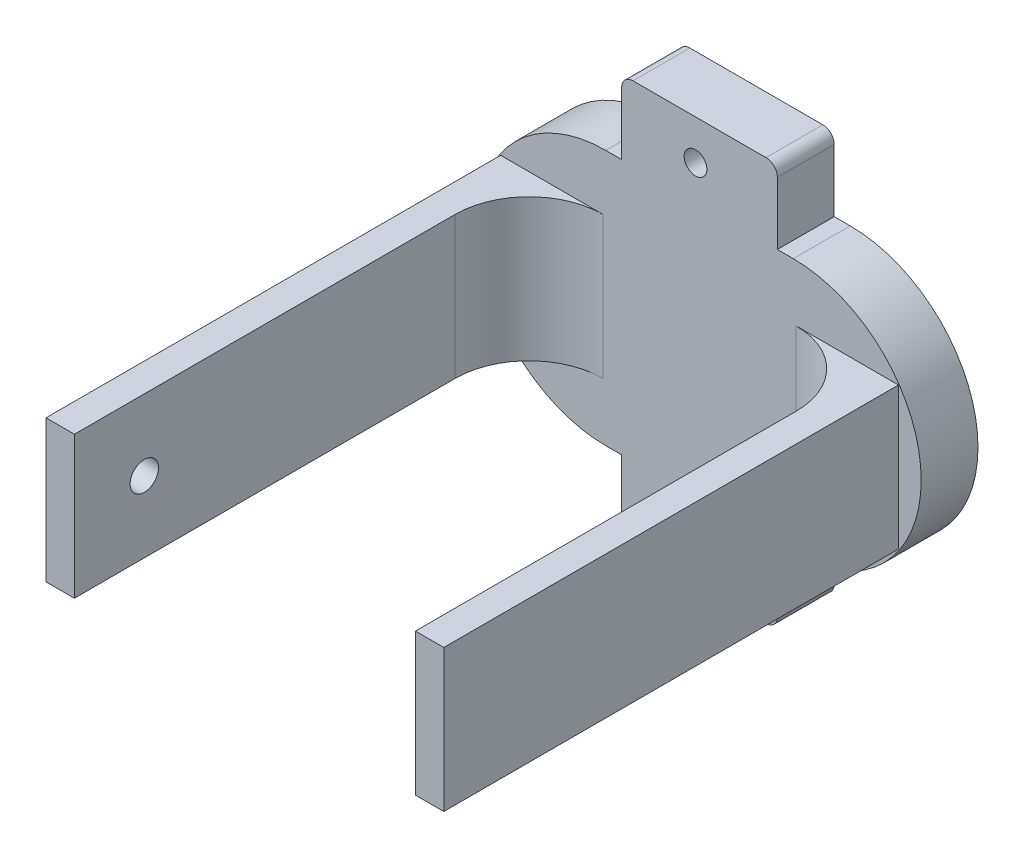
ISO-10303-21;
HEADER;
FILE_DESCRIPTION(('STEP AP214'),'2;1');
FILE_NAME('part.step','',(''),(''),'','','');
FILE_SCHEMA(('AUTOMOTIVE_DESIGN { 1 0 10303 214 1 1 1 1 }'));
ENDSEC;
DATA;
#1=APPLICATION_CONTEXT('core data for automotive mechanical design processes');
#2=APPLICATION_PROTOCOL_DEFINITION('international standard','automotive_design',2000,#1);
#3=PRODUCT_CONTEXT('',#1,'mechanical');
#4=PRODUCT('Part','Part','',(#3));
#5=PRODUCT_RELATED_PRODUCT_CATEGORY('part','',(#4));
#6=PRODUCT_DEFINITION_FORMATION('','',#4);
#7=PRODUCT_DEFINITION_CONTEXT('part definition',#1,'design');
#8=PRODUCT_DEFINITION('design','',#6,#7);
#9=PRODUCT_DEFINITION_SHAPE('','',#8);
#10=(LENGTH_UNIT() NAMED_UNIT(*) SI_UNIT(.MILLI.,.METRE.));
#11=(NAMED_UNIT(*) PLANE_ANGLE_UNIT() SI_UNIT($,.RADIAN.));
#12=(NAMED_UNIT(*) SI_UNIT($,.STERADIAN.) SOLID_ANGLE_UNIT());
#13=UNCERTAINTY_MEASURE_WITH_UNIT(LENGTH_MEASURE(1.E-05),#10,'distance_accuracy_value','');
#14=(GEOMETRIC_REPRESENTATION_CONTEXT(3) GLOBAL_UNCERTAINTY_ASSIGNED_CONTEXT((#13)) GLOBAL_UNIT_ASSIGNED_CONTEXT((#10,
#11,#12)) REPRESENTATION_CONTEXT('',''));
#15=CARTESIAN_POINT('',(0.,0.,0.));
#16=DIRECTION('',(0.,0.,1.));
#17=DIRECTION('',(1.,0.,0.));
#18=AXIS2_PLACEMENT_3D('',#15,#16,#17);
#19=CARTESIAN_POINT('',(0.,0.,10.));
#20=DIRECTION('',(0.,0.,1.));
#21=DIRECTION('',(1.,0.,0.));
#22=AXIS2_PLACEMENT_3D('',#19,#20,#21);
#23=PLANE('',#22);
#24=DIRECTION('',(1.,0.,0.));
#25=VECTOR('',#24,1.);
#26=CARTESIAN_POINT('',(0.,-12.0110356809564,10.));
#27=LINE('',#26,#25);
#28=CARTESIAN_POINT('',(-12.8672296186871,-12.0110356809564,10.));
#29=VERTEX_POINT('',#28);
#30=CARTESIAN_POINT('',(-10.0672296186871,-12.0110356809564,10.));
#31=VERTEX_POINT('',#30);
#32=EDGE_CURVE('E288',#29,#31,#27,.T.);
#33=ORIENTED_EDGE('',*,*,#32,.T.);
#34=DIRECTION('',(0.,-1.,0.));
#35=VECTOR('',#34,1.);
#36=CARTESIAN_POINT('',(-10.0672296186871,0.,10.));
#37=LINE('',#36,#35);
#38=CARTESIAN_POINT('',(-10.0672296186871,-23.0110356809564,10.));
#39=VERTEX_POINT('',#38);
#40=EDGE_CURVE('E292',#31,#39,#37,.T.);
#41=ORIENTED_EDGE('',*,*,#40,.T.);
#42=CARTESIAN_POINT('',(-8.06722961868711,-23.0110356809564,10.));
#43=DIRECTION('',(0.,0.,1.));
#44=DIRECTION('',(1.,0.,0.));
#45=AXIS2_PLACEMENT_3D('',#42,#43,#44);
#46=CIRCLE('',#45,2.);
#47=CARTESIAN_POINT('',(-8.06722961868711,-25.0110356809565,10.));
#48=VERTEX_POINT('',#47);
#49=EDGE_CURVE('E297',#48,#39,#46,.F.);
#50=ORIENTED_EDGE('',*,*,#49,.F.);
#51=DIRECTION('',(1.,0.,0.));
#52=VECTOR('',#51,1.);
#53=CARTESIAN_POINT('',(0.,-25.0110356809565,10.));
#54=LINE('',#53,#52);
#55=CARTESIAN_POINT('',(15.3327703813129,-25.0110356809564,10.));
#56=VERTEX_POINT('',#55);
#57=EDGE_CURVE('E301',#48,#56,#54,.T.);
#58=ORIENTED_EDGE('',*,*,#57,.T.);
#59=CARTESIAN_POINT('',(15.3327703813129,-23.0110356809564,10.));
#60=DIRECTION('',(0.,0.,1.));
#61=DIRECTION('',(1.,0.,0.));
#62=AXIS2_PLACEMENT_3D('',#59,#60,#61);
#63=CIRCLE('',#62,2.);
#64=CARTESIAN_POINT('',(17.3327703813129,-23.0110356809564,10.));
#65=VERTEX_POINT('',#64);
#66=EDGE_CURVE('E304',#56,#65,#63,.T.);
#67=ORIENTED_EDGE('',*,*,#66,.T.);
#68=DIRECTION('',(0.,-1.,0.));
#69=VECTOR('',#68,1.);
#70=CARTESIAN_POINT('',(17.3327703813129,0.,10.));
#71=LINE('',#70,#69);
#72=CARTESIAN_POINT('',(17.3327703813129,-12.0110356809564,10.));
#73=VERTEX_POINT('',#72);
#74=EDGE_CURVE('E307',#73,#65,#71,.T.);
#75=ORIENTED_EDGE('',*,*,#74,.F.);
#76=CARTESIAN_POINT('',(20.1327703813129,-12.0110356809564,10.));
#77=VERTEX_POINT('',#76);
#78=EDGE_CURVE('E294',#73,#77,#27,.T.);
#79=ORIENTED_EDGE('',*,*,#78,.T.);
#80=CARTESIAN_POINT('',(20.1327703813129,10.4889643190436,10.));
#81=DIRECTION('',(0.,0.,1.));
#82=DIRECTION('',(1.,0.,0.));
#83=AXIS2_PLACEMENT_3D('',#80,#81,#82);
#84=CIRCLE('',#83,22.5);
#85=CARTESIAN_POINT('',(20.1327703813129,32.9889643190436,10.));
#86=VERTEX_POINT('',#85);
#87=EDGE_CURVE('E311',#77,#86,#84,.T.);
#88=ORIENTED_EDGE('',*,*,#87,.T.);
#89=DIRECTION('',(1.,0.,0.));
#90=VECTOR('',#89,1.);
#91=CARTESIAN_POINT('',(0.,32.9889643190436,10.));
#92=LINE('',#91,#90);
#93=CARTESIAN_POINT('',(17.3327703813129,32.9889643190436,10.));
#94=VERTEX_POINT('',#93);
#95=EDGE_CURVE('E314',#94,#86,#92,.T.);
#96=ORIENTED_EDGE('',*,*,#95,.F.);
#97=DIRECTION('',(0.,1.,0.));
#98=VECTOR('',#97,1.);
#99=CARTESIAN_POINT('',(17.3327703813129,0.,10.));
#100=LINE('',#99,#98);
#101=CARTESIAN_POINT('',(17.3327703813129,43.9889643190435,10.));
#102=VERTEX_POINT('',#101);
#103=EDGE_CURVE('E318',#94,#102,#100,.T.);
#104=ORIENTED_EDGE('',*,*,#103,.T.);
#105=CARTESIAN_POINT('',(15.3327703813129,43.9889643190435,10.));
#106=DIRECTION('',(0.,0.,1.));
#107=DIRECTION('',(1.,0.,0.));
#108=AXIS2_PLACEMENT_3D('',#105,#106,#107);
#109=CIRCLE('',#108,2.);
#110=CARTESIAN_POINT('',(15.3327703813129,45.9889643190435,10.));
#111=VERTEX_POINT('',#110);
#112=EDGE_CURVE('E322',#102,#111,#109,.T.);
#113=ORIENTED_EDGE('',*,*,#112,.T.);
#114=DIRECTION('',(1.,0.,0.));
#115=VECTOR('',#114,1.);
#116=CARTESIAN_POINT('',(0.,45.9889643190435,10.));
#117=LINE('',#116,#115);
#118=CARTESIAN_POINT('',(-8.06722961868712,45.9889643190435,10.));
#119=VERTEX_POINT('',#118);
#120=EDGE_CURVE('E325',#119,#111,#117,.T.);
#121=ORIENTED_EDGE('',*,*,#120,.F.);
#122=CARTESIAN_POINT('',(-8.06722961868712,43.9889643190435,10.));
#123=DIRECTION('',(0.,0.,1.));
#124=DIRECTION('',(1.,0.,0.));
#125=AXIS2_PLACEMENT_3D('',#122,#123,#124);
#126=CIRCLE('',#125,2.);
#127=CARTESIAN_POINT('',(-10.0672296186871,43.9889643190435,10.));
#128=VERTEX_POINT('',#127);
#129=EDGE_CURVE('E329',#119,#128,#126,.T.);
#130=ORIENTED_EDGE('',*,*,#129,.T.);
#131=DIRECTION('',(0.,1.,0.));
#132=VECTOR('',#131,1.);
#133=CARTESIAN_POINT('',(-10.0672296186871,0.,10.));
#134=LINE('',#133,#132);
#135=CARTESIAN_POINT('',(-10.0672296186871,32.9889643190436,10.));
#136=VERTEX_POINT('',#135);
#137=EDGE_CURVE('E332',#136,#128,#134,.T.);
#138=ORIENTED_EDGE('',*,*,#137,.F.);
#139=CARTESIAN_POINT('',(-12.8672296186871,32.9889643190436,10.));
#140=VERTEX_POINT('',#139);
#141=EDGE_CURVE('E319',#140,#136,#92,.T.);
#142=ORIENTED_EDGE('',*,*,#141,.F.);
#143=CARTESIAN_POINT('',(-12.8672296186871,10.4889643190436,10.));
#144=DIRECTION('',(0.,0.,1.));
#145=DIRECTION('',(1.,0.,0.));
#146=AXIS2_PLACEMENT_3D('',#143,#144,#145);
#147=CIRCLE('',#146,22.5);
#148=EDGE_CURVE('E336',#140,#29,#147,.T.);
#149=ORIENTED_EDGE('',*,*,#148,.T.);
#150=EDGE_LOOP('',(#33,#41,#50,#58,#67,#75,#79,#88,#96,#104,#113,#121,#130,#138,#142,#149));
#151=FACE_BOUND('',#150,.T.);
#152=CARTESIAN_POINT('',(2.9214645974782,38.9889643190435,10.));
#153=DIRECTION('',(0.,0.,1.));
#154=DIRECTION('',(1.,0.,0.));
#155=AXIS2_PLACEMENT_3D('',#152,#153,#154);
#156=CIRCLE('',#155,2.);
#157=CARTESIAN_POINT('',(4.9214645974782,38.9889643190435,10.));
#158=VERTEX_POINT('',#157);
#159=EDGE_CURVE('E339',#158,#158,#156,.T.);
#160=ORIENTED_EDGE('',*,*,#159,.F.);
#161=EDGE_LOOP('',(#160));
#162=FACE_BOUND('',#161,.T.);
#163=CARTESIAN_POINT('',(2.9214645974782,-18.0110356809564,10.));
#164=DIRECTION('',(0.,0.,1.));
#165=DIRECTION('',(1.,0.,0.));
#166=AXIS2_PLACEMENT_3D('',#163,#164,#165);
#167=CIRCLE('',#166,2.);
#168=CARTESIAN_POINT('',(4.9214645974782,-18.0110356809564,10.));
#169=VERTEX_POINT('',#168);
#170=EDGE_CURVE('E343',#169,#169,#167,.T.);
#171=ORIENTED_EDGE('',*,*,#170,.F.);
#172=EDGE_LOOP('',(#171));
#173=FACE_BOUND('',#172,.T.);
#174=DIRECTION('',(1.,0.,0.));
#175=VECTOR('',#174,1.);
#176=CARTESIAN_POINT('',(0.,22.9889643190436,10.));
#177=LINE('',#176,#175);
#178=CARTESIAN_POINT('',(-31.3672296186871,22.9889643190436,10.));
#179=VERTEX_POINT('',#178);
#180=CARTESIAN_POINT('',(-13.3672296186871,22.9889643190436,10.));
#181=VERTEX_POINT('',#180);
#182=EDGE_CURVE('E57',#179,#181,#177,.T.);
#183=ORIENTED_EDGE('',*,*,#182,.T.);
#184=DIRECTION('',(0.,-1.,0.));
#185=VECTOR('',#184,1.);
#186=CARTESIAN_POINT('',(-13.3672296186871,22.9889643190436,10.));
#187=LINE('',#186,#185);
#188=CARTESIAN_POINT('',(-13.3672296186871,-2.01103568095645,10.));
#189=VERTEX_POINT('',#188);
#190=EDGE_CURVE('E868',#181,#189,#187,.T.);
#191=ORIENTED_EDGE('',*,*,#190,.T.);
#192=DIRECTION('',(1.,0.,0.));
#193=VECTOR('',#192,1.);
#194=CARTESIAN_POINT('',(0.,-2.01103568095645,10.));
#195=LINE('',#194,#193);
#196=CARTESIAN_POINT('',(-31.3672296186871,-2.01103568095645,10.));
#197=VERTEX_POINT('',#196);
#198=EDGE_CURVE('E65',#197,#189,#195,.T.);
#199=ORIENTED_EDGE('',*,*,#198,.F.);
#200=DIRECTION('',(0.,-1.,0.));
#201=VECTOR('',#200,1.);
#202=CARTESIAN_POINT('',(-31.3672296186871,0.,10.));
#203=LINE('',#202,#201);
#204=EDGE_CURVE('E249',#179,#197,#203,.T.);
#205=ORIENTED_EDGE('',*,*,#204,.F.);
#206=EDGE_LOOP('',(#183,#191,#199,#205));
#207=FACE_BOUND('',#206,.T.);
#208=DIRECTION('',(0.,-1.,0.));
#209=VECTOR('',#208,1.);
#210=CARTESIAN_POINT('',(20.6327703813128,22.9889643190436,10.));
#211=LINE('',#210,#209);
#212=CARTESIAN_POINT('',(20.6327703813128,22.9889643190436,10.));
#213=VERTEX_POINT('',#212);
#214=CARTESIAN_POINT('',(20.6327703813128,-2.01103568095645,10.));
#215=VERTEX_POINT('',#214);
#216=EDGE_CURVE('E230',#213,#215,#211,.T.);
#217=ORIENTED_EDGE('',*,*,#216,.F.);
#218=DIRECTION('',(1.,0.,0.));
#219=VECTOR('',#218,1.);
#220=CARTESIAN_POINT('',(0.,22.9889643190436,10.));
#221=LINE('',#220,#219);
#222=CARTESIAN_POINT('',(38.6327703813129,22.9889643190436,10.));
#223=VERTEX_POINT('',#222);
#224=EDGE_CURVE('E238',#213,#223,#221,.T.);
#225=ORIENTED_EDGE('',*,*,#224,.T.);
#226=DIRECTION('',(0.,-1.,0.));
#227=VECTOR('',#226,1.);
#228=CARTESIAN_POINT('',(38.6327703813129,0.,10.));
#229=LINE('',#228,#227);
#230=CARTESIAN_POINT('',(38.6327703813129,-2.01103568095645,10.));
#231=VERTEX_POINT('',#230);
#232=EDGE_CURVE('E882',#223,#231,#229,.T.);
#233=ORIENTED_EDGE('',*,*,#232,.T.);
#234=DIRECTION('',(1.,0.,0.));
#235=VECTOR('',#234,1.);
#236=CARTESIAN_POINT('',(0.,-2.01103568095645,10.));
#237=LINE('',#236,#235);
#238=EDGE_CURVE('E895',#215,#231,#237,.T.);
#239=ORIENTED_EDGE('',*,*,#238,.F.);
#240=EDGE_LOOP('',(#217,#225,#233,#239));
#241=FACE_BOUND('',#240,.T.);
#242=ADVANCED_FACE('F41',(#151,#162,#173,#207,#241),#23,.T.);
#243=CARTESIAN_POINT('',(33.6327703813129,0.,90.));
#244=DIRECTION('',(1.,0.,0.));
#245=DIRECTION('',(0.,0.,-1.));
#246=AXIS2_PLACEMENT_3D('',#243,#244,#245);
#247=PLANE('',#246);
#248=DIRECTION('',(0.,-1.,0.));
#249=VECTOR('',#248,1.);
#250=CARTESIAN_POINT('',(33.6327703813129,22.9889643190436,23.0000000000001));
#251=LINE('',#250,#249);
#252=CARTESIAN_POINT('',(33.6327703813129,22.9889643190436,23.0000000000001));
#253=VERTEX_POINT('',#252);
#254=CARTESIAN_POINT('',(33.6327703813129,-2.01103568095645,23.0000000000001));
#255=VERTEX_POINT('',#254);
#256=EDGE_CURVE('E217',#253,#255,#251,.T.);
#257=ORIENTED_EDGE('',*,*,#256,.T.);
#258=DIRECTION('',(0.,0.,-1.));
#259=VECTOR('',#258,1.);
#260=CARTESIAN_POINT('',(33.6327703813129,-2.01103568095645,90.));
#261=LINE('',#260,#259);
#262=CARTESIAN_POINT('',(33.6327703813129,-2.01103568095645,90.));
#263=VERTEX_POINT('',#262);
#264=EDGE_CURVE('E245',#263,#255,#261,.T.);
#265=ORIENTED_EDGE('',*,*,#264,.F.);
#266=DIRECTION('',(0.,-1.,0.));
#267=VECTOR('',#266,1.);
#268=CARTESIAN_POINT('',(33.6327703813129,0.,90.));
#269=LINE('',#268,#267);
#270=CARTESIAN_POINT('',(33.6327703813129,22.9889643190436,90.));
#271=VERTEX_POINT('',#270);
#272=EDGE_CURVE('E242',#271,#263,#269,.T.);
#273=ORIENTED_EDGE('',*,*,#272,.F.);
#274=DIRECTION('',(0.,0.,-1.));
#275=VECTOR('',#274,1.);
#276=CARTESIAN_POINT('',(33.6327703813129,22.9889643190436,90.));
#277=LINE('',#276,#275);
#278=EDGE_CURVE('E235',#271,#253,#277,.T.);
#279=ORIENTED_EDGE('',*,*,#278,.T.);
#280=EDGE_LOOP('',(#257,#265,#273,#279));
#281=FACE_BOUND('',#280,.T.);
#282=ADVANCED_FACE('F241',(#281),#247,.F.);
#283=CARTESIAN_POINT('',(-26.3672296186871,0.,90.));
#284=DIRECTION('',(1.,0.,0.));
#285=DIRECTION('',(0.,1.,0.));
#286=AXIS2_PLACEMENT_3D('',#283,#284,#285);
#287=PLANE('',#286);
#288=CARTESIAN_POINT('',(-26.3672296186871,10.4889643190436,77.7));
#289=DIRECTION('',(1.,0.,0.));
#290=DIRECTION('',(0.,1.,0.));
#291=AXIS2_PLACEMENT_3D('',#288,#289,#290);
#292=CIRCLE('',#291,2.5);
#293=CARTESIAN_POINT('',(-26.3672296186871,12.9889643190435,77.7));
#294=VERTEX_POINT('',#293);
#295=EDGE_CURVE('E856',#294,#294,#292,.T.);
#296=ORIENTED_EDGE('',*,*,#295,.F.);
#297=EDGE_LOOP('',(#296));
#298=FACE_BOUND('',#297,.T.);
#299=DIRECTION('',(0.,0.,-1.));
#300=VECTOR('',#299,1.);
#301=CARTESIAN_POINT('',(-26.3672296186871,-2.01103568095645,90.));
#302=LINE('',#301,#300);
#303=CARTESIAN_POINT('',(-26.3672296186871,-2.01103568095645,90.));
#304=VERTEX_POINT('',#303);
#305=CARTESIAN_POINT('',(-26.3672296186871,-2.01103568095645,23.));
#306=VERTEX_POINT('',#305);
#307=EDGE_CURVE('E268',#304,#306,#302,.T.);
#308=ORIENTED_EDGE('',*,*,#307,.T.);
#309=DIRECTION('',(0.,-1.,0.));
#310=VECTOR('',#309,1.);
#311=CARTESIAN_POINT('',(-26.3672296186871,22.9889643190436,23.));
#312=LINE('',#311,#310);
#313=CARTESIAN_POINT('',(-26.3672296186871,22.9889643190436,23.));
#314=VERTEX_POINT('',#313);
#315=EDGE_CURVE('E859',#314,#306,#312,.T.);
#316=ORIENTED_EDGE('',*,*,#315,.F.);
#317=DIRECTION('',(0.,0.,-1.));
#318=VECTOR('',#317,1.);
#319=CARTESIAN_POINT('',(-26.3672296186871,22.9889643190436,90.));
#320=LINE('',#319,#318);
#321=CARTESIAN_POINT('',(-26.3672296186871,22.9889643190436,90.));
#322=VERTEX_POINT('',#321);
#323=EDGE_CURVE('E283',#322,#314,#320,.T.);
#324=ORIENTED_EDGE('',*,*,#323,.F.);
#325=DIRECTION('',(0.,-1.,0.));
#326=VECTOR('',#325,1.);
#327=CARTESIAN_POINT('',(-26.3672296186871,0.,90.));
#328=LINE('',#327,#326);
#329=EDGE_CURVE('E255',#322,#304,#328,.T.);
#330=ORIENTED_EDGE('',*,*,#329,.T.);
#331=EDGE_LOOP('',(#308,#316,#324,#330));
#332=FACE_BOUND('',#331,.T.);
#333=ADVANCED_FACE('F546',(#298,#332),#287,.T.);
#334=CARTESIAN_POINT('',(0.,-12.0110356809564,10.));
#335=DIRECTION('',(0.,1.,0.));
#336=DIRECTION('',(0.,0.,1.));
#337=AXIS2_PLACEMENT_3D('',#334,#335,#336);
#338=PLANE('',#337);
#339=DIRECTION('',(1.,0.,0.));
#340=VECTOR('',#339,1.);
#341=CARTESIAN_POINT('',(0.,-12.0110356809564,0.));
#342=LINE('',#341,#340);
#343=CARTESIAN_POINT('',(-12.8672296186871,-12.0110356809564,0.));
#344=VERTEX_POINT('',#343);
#345=CARTESIAN_POINT('',(-10.0672296186871,-12.0110356809564,0.));
#346=VERTEX_POINT('',#345);
#347=EDGE_CURVE('E287',#344,#346,#342,.T.);
#348=ORIENTED_EDGE('',*,*,#347,.T.);
#349=DIRECTION('',(0.,0.,-1.));
#350=VECTOR('',#349,1.);
#351=CARTESIAN_POINT('',(-10.0672296186871,-12.0110356809564,10.));
#352=LINE('',#351,#350);
#353=EDGE_CURVE('E11',#31,#346,#352,.T.);
#354=ORIENTED_EDGE('',*,*,#353,.F.);
#355=ORIENTED_EDGE('',*,*,#32,.F.);
#356=DIRECTION('',(0.,0.,-1.));
#357=VECTOR('',#356,1.);
#358=CARTESIAN_POINT('',(-12.8672296186871,-12.0110356809564,10.));
#359=LINE('',#358,#357);
#360=EDGE_CURVE('E347',#29,#344,#359,.T.);
#361=ORIENTED_EDGE('',*,*,#360,.T.);
#362=EDGE_LOOP('',(#348,#354,#355,#361));
#363=FACE_BOUND('',#362,.T.);
#364=ADVANCED_FACE('F483',(#363),#338,.F.);
#365=CARTESIAN_POINT('',(-10.0672296186871,0.,10.));
#366=DIRECTION('',(1.,0.,0.));
#367=DIRECTION('',(0.,1.,0.));
#368=AXIS2_PLACEMENT_3D('',#365,#366,#367);
#369=PLANE('',#368);
#370=DIRECTION('',(0.,-1.,0.));
#371=VECTOR('',#370,1.);
#372=CARTESIAN_POINT('',(-10.0672296186871,0.,0.));
#373=LINE('',#372,#371);
#374=CARTESIAN_POINT('',(-10.0672296186871,-23.0110356809564,0.));
#375=VERTEX_POINT('',#374);
#376=EDGE_CURVE('E351',#346,#375,#373,.T.);
#377=ORIENTED_EDGE('',*,*,#376,.T.);
#378=DIRECTION('',(0.,0.,-1.));
#379=VECTOR('',#378,1.);
#380=CARTESIAN_POINT('',(-10.0672296186871,-23.0110356809564,10.));
#381=LINE('',#380,#379);
#382=EDGE_CURVE('E50',#39,#375,#381,.T.);
#383=ORIENTED_EDGE('',*,*,#382,.F.);
#384=ORIENTED_EDGE('',*,*,#40,.F.);
#385=ORIENTED_EDGE('',*,*,#353,.T.);
#386=EDGE_LOOP('',(#377,#383,#384,#385));
#387=FACE_BOUND('',#386,.T.);
#388=ADVANCED_FACE('F43',(#387),#369,.F.);
#389=CARTESIAN_POINT('',(-8.06722961868711,-23.0110356809564,10.));
#390=DIRECTION('',(0.,0.,-1.));
#391=DIRECTION('',(-1.,0.,0.));
#392=AXIS2_PLACEMENT_3D('',#389,#390,#391);
#393=CYLINDRICAL_SURFACE('',#392,2.);
#394=CARTESIAN_POINT('',(-8.06722961868711,-23.0110356809564,0.));
#395=DIRECTION('',(0.,0.,1.));
#396=DIRECTION('',(1.,0.,0.));
#397=AXIS2_PLACEMENT_3D('',#394,#395,#396);
#398=CIRCLE('',#397,2.);
#399=CARTESIAN_POINT('',(-8.06722961868711,-25.0110356809565,0.));
#400=VERTEX_POINT('',#399);
#401=EDGE_CURVE('E356',#400,#375,#398,.F.);
#402=ORIENTED_EDGE('',*,*,#401,.F.);
#403=DIRECTION('',(0.,0.,-1.));
#404=VECTOR('',#403,1.);
#405=CARTESIAN_POINT('',(-8.06722961868711,-25.0110356809565,10.));
#406=LINE('',#405,#404);
#407=EDGE_CURVE('E451',#48,#400,#406,.T.);
#408=ORIENTED_EDGE('',*,*,#407,.F.);
#409=ORIENTED_EDGE('',*,*,#49,.T.);
#410=ORIENTED_EDGE('',*,*,#382,.T.);
#411=EDGE_LOOP('',(#402,#408,#409,#410));
#412=FACE_BOUND('',#411,.T.);
#413=ADVANCED_FACE('F457',(#412),#393,.T.);
#414=CARTESIAN_POINT('',(0.,-25.0110356809565,10.));
#415=DIRECTION('',(0.,1.,0.));
#416=DIRECTION('',(-1.,0.,0.));
#417=AXIS2_PLACEMENT_3D('',#414,#415,#416);
#418=PLANE('',#417);
#419=DIRECTION('',(1.,0.,0.));
#420=VECTOR('',#419,1.);
#421=CARTESIAN_POINT('',(0.,-25.0110356809565,0.));
#422=LINE('',#421,#420);
#423=CARTESIAN_POINT('',(15.3327703813129,-25.0110356809564,0.));
#424=VERTEX_POINT('',#423);
#425=EDGE_CURVE('E360',#400,#424,#422,.T.);
#426=ORIENTED_EDGE('',*,*,#425,.T.);
#427=DIRECTION('',(0.,0.,-1.));
#428=VECTOR('',#427,1.);
#429=CARTESIAN_POINT('',(15.3327703813129,-25.0110356809564,10.));
#430=LINE('',#429,#428);
#431=EDGE_CURVE('E447',#56,#424,#430,.T.);
#432=ORIENTED_EDGE('',*,*,#431,.F.);
#433=ORIENTED_EDGE('',*,*,#57,.F.);
#434=ORIENTED_EDGE('',*,*,#407,.T.);
#435=EDGE_LOOP('',(#426,#432,#433,#434));
#436=FACE_BOUND('',#435,.T.);
#437=ADVANCED_FACE('F469',(#436),#418,.F.);
#438=CARTESIAN_POINT('',(15.3327703813129,-23.0110356809564,10.));
#439=DIRECTION('',(0.,0.,-1.));
#440=DIRECTION('',(-1.,0.,0.));
#441=AXIS2_PLACEMENT_3D('',#438,#439,#440);
#442=CYLINDRICAL_SURFACE('',#441,2.);
#443=CARTESIAN_POINT('',(15.3327703813129,-23.0110356809564,0.));
#444=DIRECTION('',(0.,0.,1.));
#445=DIRECTION('',(1.,0.,0.));
#446=AXIS2_PLACEMENT_3D('',#443,#444,#445);
#447=CIRCLE('',#446,2.);
#448=CARTESIAN_POINT('',(17.3327703813129,-23.0110356809564,0.));
#449=VERTEX_POINT('',#448);
#450=EDGE_CURVE('E363',#424,#449,#447,.T.);
#451=ORIENTED_EDGE('',*,*,#450,.T.);
#452=DIRECTION('',(0.,0.,-1.));
#453=VECTOR('',#452,1.);
#454=CARTESIAN_POINT('',(17.3327703813129,-23.0110356809564,10.));
#455=LINE('',#454,#453);
#456=EDGE_CURVE('E444',#65,#449,#455,.T.);
#457=ORIENTED_EDGE('',*,*,#456,.F.);
#458=ORIENTED_EDGE('',*,*,#66,.F.);
#459=ORIENTED_EDGE('',*,*,#431,.T.);
#460=EDGE_LOOP('',(#451,#457,#458,#459));
#461=FACE_BOUND('',#460,.T.);
#462=ADVANCED_FACE('F473',(#461),#442,.T.);
#463=CARTESIAN_POINT('',(17.3327703813129,0.,10.));
#464=DIRECTION('',(1.,0.,0.));
#465=DIRECTION('',(0.,0.,-1.));
#466=AXIS2_PLACEMENT_3D('',#463,#464,#465);
#467=PLANE('',#466);
#468=DIRECTION('',(0.,-1.,0.));
#469=VECTOR('',#468,1.);
#470=CARTESIAN_POINT('',(17.3327703813129,0.,0.));
#471=LINE('',#470,#469);
#472=CARTESIAN_POINT('',(17.3327703813129,-12.0110356809564,0.));
#473=VERTEX_POINT('',#472);
#474=EDGE_CURVE('E367',#473,#449,#471,.T.);
#475=ORIENTED_EDGE('',*,*,#474,.F.);
#476=DIRECTION('',(0.,0.,-1.));
#477=VECTOR('',#476,1.);
#478=CARTESIAN_POINT('',(17.3327703813129,-12.0110356809564,10.));
#479=LINE('',#478,#477);
#480=EDGE_CURVE('E441',#73,#473,#479,.T.);
#481=ORIENTED_EDGE('',*,*,#480,.F.);
#482=ORIENTED_EDGE('',*,*,#74,.T.);
#483=ORIENTED_EDGE('',*,*,#456,.T.);
#484=EDGE_LOOP('',(#475,#481,#482,#483));
#485=FACE_BOUND('',#484,.T.);
#486=ADVANCED_FACE('F747',(#485),#467,.T.);
#487=CARTESIAN_POINT('',(20.1327703813129,-12.0110356809564,0.));
#488=VERTEX_POINT('',#487);
#489=EDGE_CURVE('E352',#473,#488,#342,.T.);
#490=ORIENTED_EDGE('',*,*,#489,.T.);
#491=DIRECTION('',(0.,0.,-1.));
#492=VECTOR('',#491,1.);
#493=CARTESIAN_POINT('',(20.1327703813129,-12.0110356809564,10.));
#494=LINE('',#493,#492);
#495=EDGE_CURVE('E437',#77,#488,#494,.T.);
#496=ORIENTED_EDGE('',*,*,#495,.F.);
#497=ORIENTED_EDGE('',*,*,#78,.F.);
#498=ORIENTED_EDGE('',*,*,#480,.T.);
#499=EDGE_LOOP('',(#490,#496,#497,#498));
#500=FACE_BOUND('',#499,.T.);
#501=ADVANCED_FACE('F497',(#500),#338,.F.);
#502=CARTESIAN_POINT('',(20.1327703813129,10.4889643190436,10.));
#503=DIRECTION('',(0.,0.,-1.));
#504=DIRECTION('',(-1.,0.,0.));
#505=AXIS2_PLACEMENT_3D('',#502,#503,#504);
#506=CYLINDRICAL_SURFACE('',#505,22.5);
#507=CARTESIAN_POINT('',(20.1327703813129,10.4889643190436,0.));
#508=DIRECTION('',(0.,0.,1.));
#509=DIRECTION('',(1.,0.,0.));
#510=AXIS2_PLACEMENT_3D('',#507,#508,#509);
#511=CIRCLE('',#510,22.5);
#512=CARTESIAN_POINT('',(20.1327703813129,32.9889643190436,0.));
#513=VERTEX_POINT('',#512);
#514=EDGE_CURVE('E371',#488,#513,#511,.T.);
#515=ORIENTED_EDGE('',*,*,#514,.T.);
#516=DIRECTION('',(0.,0.,-1.));
#517=VECTOR('',#516,1.);
#518=CARTESIAN_POINT('',(20.1327703813129,32.9889643190436,10.));
#519=LINE('',#518,#517);
#520=EDGE_CURVE('E434',#86,#513,#519,.T.);
#521=ORIENTED_EDGE('',*,*,#520,.F.);
#522=ORIENTED_EDGE('',*,*,#87,.F.);
#523=ORIENTED_EDGE('',*,*,#495,.T.);
#524=EDGE_LOOP('',(#515,#521,#522,#523));
#525=FACE_BOUND('',#524,.T.);
#526=ADVANCED_FACE('F503',(#525),#506,.T.);
#527=CARTESIAN_POINT('',(0.,32.9889643190436,10.));
#528=DIRECTION('',(0.,1.,0.));
#529=DIRECTION('',(0.,0.,1.));
#530=AXIS2_PLACEMENT_3D('',#527,#528,#529);
#531=PLANE('',#530);
#532=DIRECTION('',(1.,0.,0.));
#533=VECTOR('',#532,1.);
#534=CARTESIAN_POINT('',(0.,32.9889643190436,0.));
#535=LINE('',#534,#533);
#536=CARTESIAN_POINT('',(17.3327703813129,32.9889643190436,0.));
#537=VERTEX_POINT('',#536);
#538=EDGE_CURVE('E375',#537,#513,#535,.T.);
#539=ORIENTED_EDGE('',*,*,#538,.F.);
#540=DIRECTION('',(0.,0.,-1.));
#541=VECTOR('',#540,1.);
#542=CARTESIAN_POINT('',(17.3327703813129,32.9889643190436,10.));
#543=LINE('',#542,#541);
#544=EDGE_CURVE('E431',#94,#537,#543,.T.);
#545=ORIENTED_EDGE('',*,*,#544,.F.);
#546=ORIENTED_EDGE('',*,*,#95,.T.);
#547=ORIENTED_EDGE('',*,*,#520,.T.);
#548=EDGE_LOOP('',(#539,#545,#546,#547));
#549=FACE_BOUND('',#548,.T.);
#550=ADVANCED_FACE('F509',(#549),#531,.T.);
#551=CARTESIAN_POINT('',(17.3327703813129,0.,10.));
#552=DIRECTION('',(-1.,0.,0.));
#553=DIRECTION('',(0.,0.,1.));
#554=AXIS2_PLACEMENT_3D('',#551,#552,#553);
#555=PLANE('',#554);
#556=DIRECTION('',(0.,1.,0.));
#557=VECTOR('',#556,1.);
#558=CARTESIAN_POINT('',(17.3327703813129,0.,0.));
#559=LINE('',#558,#557);
#560=CARTESIAN_POINT('',(17.3327703813129,43.9889643190435,0.));
#561=VERTEX_POINT('',#560);
#562=EDGE_CURVE('E379',#537,#561,#559,.T.);
#563=ORIENTED_EDGE('',*,*,#562,.T.);
#564=DIRECTION('',(0.,0.,-1.));
#565=VECTOR('',#564,1.);
#566=CARTESIAN_POINT('',(17.3327703813129,43.9889643190435,10.));
#567=LINE('',#566,#565);
#568=EDGE_CURVE('E427',#102,#561,#567,.T.);
#569=ORIENTED_EDGE('',*,*,#568,.F.);
#570=ORIENTED_EDGE('',*,*,#103,.F.);
#571=ORIENTED_EDGE('',*,*,#544,.T.);
#572=EDGE_LOOP('',(#563,#569,#570,#571));
#573=FACE_BOUND('',#572,.T.);
#574=ADVANCED_FACE('F531',(#573),#555,.F.);
#575=CARTESIAN_POINT('',(15.3327703813129,43.9889643190435,10.));
#576=DIRECTION('',(0.,0.,-1.));
#577=DIRECTION('',(-1.,0.,0.));
#578=AXIS2_PLACEMENT_3D('',#575,#576,#577);
#579=CYLINDRICAL_SURFACE('',#578,2.);
#580=CARTESIAN_POINT('',(15.3327703813129,43.9889643190435,0.));
#581=DIRECTION('',(0.,0.,1.));
#582=DIRECTION('',(1.,0.,0.));
#583=AXIS2_PLACEMENT_3D('',#580,#581,#582);
#584=CIRCLE('',#583,2.);
#585=CARTESIAN_POINT('',(15.3327703813129,45.9889643190435,0.));
#586=VERTEX_POINT('',#585);
#587=EDGE_CURVE('E383',#561,#586,#584,.T.);
#588=ORIENTED_EDGE('',*,*,#587,.T.);
#589=DIRECTION('',(0.,0.,-1.));
#590=VECTOR('',#589,1.);
#591=CARTESIAN_POINT('',(15.3327703813129,45.9889643190435,10.));
#592=LINE('',#591,#590);
#593=EDGE_CURVE('E424',#111,#586,#592,.T.);
#594=ORIENTED_EDGE('',*,*,#593,.F.);
#595=ORIENTED_EDGE('',*,*,#112,.F.);
#596=ORIENTED_EDGE('',*,*,#568,.T.);
#597=EDGE_LOOP('',(#588,#594,#595,#596));
#598=FACE_BOUND('',#597,.T.);
#599=ADVANCED_FACE('F529',(#598),#579,.T.);
#600=CARTESIAN_POINT('',(0.,45.9889643190435,10.));
#601=DIRECTION('',(0.,1.,0.));
#602=DIRECTION('',(0.,0.,1.));
#603=AXIS2_PLACEMENT_3D('',#600,#601,#602);
#604=PLANE('',#603);
#605=DIRECTION('',(1.,0.,0.));
#606=VECTOR('',#605,1.);
#607=CARTESIAN_POINT('',(0.,45.9889643190435,0.));
#608=LINE('',#607,#606);
#609=CARTESIAN_POINT('',(-8.06722961868712,45.9889643190435,0.));
#610=VERTEX_POINT('',#609);
#611=EDGE_CURVE('E387',#610,#586,#608,.T.);
#612=ORIENTED_EDGE('',*,*,#611,.F.);
#613=DIRECTION('',(0.,0.,-1.));
#614=VECTOR('',#613,1.);
#615=CARTESIAN_POINT('',(-8.06722961868712,45.9889643190435,10.));
#616=LINE('',#615,#614);
#617=EDGE_CURVE('E421',#119,#610,#616,.T.);
#618=ORIENTED_EDGE('',*,*,#617,.F.);
#619=ORIENTED_EDGE('',*,*,#120,.T.);
#620=ORIENTED_EDGE('',*,*,#593,.T.);
#621=EDGE_LOOP('',(#612,#618,#619,#620));
#622=FACE_BOUND('',#621,.T.);
#623=ADVANCED_FACE('F525',(#622),#604,.T.);
#624=CARTESIAN_POINT('',(-8.06722961868712,43.9889643190435,10.));
#625=DIRECTION('',(0.,0.,-1.));
#626=DIRECTION('',(-1.,0.,0.));
#627=AXIS2_PLACEMENT_3D('',#624,#625,#626);
#628=CYLINDRICAL_SURFACE('',#627,2.);
#629=CARTESIAN_POINT('',(-8.06722961868712,43.9889643190435,0.));
#630=DIRECTION('',(0.,0.,1.));
#631=DIRECTION('',(1.,0.,0.));
#632=AXIS2_PLACEMENT_3D('',#629,#630,#631);
#633=CIRCLE('',#632,2.);
#634=CARTESIAN_POINT('',(-10.0672296186871,43.9889643190435,0.));
#635=VERTEX_POINT('',#634);
#636=EDGE_CURVE('E391',#610,#635,#633,.T.);
#637=ORIENTED_EDGE('',*,*,#636,.T.);
#638=DIRECTION('',(0.,0.,-1.));
#639=VECTOR('',#638,1.);
#640=CARTESIAN_POINT('',(-10.0672296186871,43.9889643190435,10.));
#641=LINE('',#640,#639);
#642=EDGE_CURVE('E418',#128,#635,#641,.T.);
#643=ORIENTED_EDGE('',*,*,#642,.F.);
#644=ORIENTED_EDGE('',*,*,#129,.F.);
#645=ORIENTED_EDGE('',*,*,#617,.T.);
#646=EDGE_LOOP('',(#637,#643,#644,#645));
#647=FACE_BOUND('',#646,.T.);
#648=ADVANCED_FACE('F568',(#647),#628,.T.);
#649=CARTESIAN_POINT('',(-10.0672296186871,0.,10.));
#650=DIRECTION('',(-1.,0.,0.));
#651=DIRECTION('',(0.,0.,1.));
#652=AXIS2_PLACEMENT_3D('',#649,#650,#651);
#653=PLANE('',#652);
#654=DIRECTION('',(0.,1.,0.));
#655=VECTOR('',#654,1.);
#656=CARTESIAN_POINT('',(-10.0672296186871,0.,0.));
#657=LINE('',#656,#655);
#658=CARTESIAN_POINT('',(-10.0672296186871,32.9889643190436,0.));
#659=VERTEX_POINT('',#658);
#660=EDGE_CURVE('E395',#659,#635,#657,.T.);
#661=ORIENTED_EDGE('',*,*,#660,.F.);
#662=DIRECTION('',(0.,0.,-1.));
#663=VECTOR('',#662,1.);
#664=CARTESIAN_POINT('',(-10.0672296186871,32.9889643190436,10.));
#665=LINE('',#664,#663);
#666=EDGE_CURVE('E415',#136,#659,#665,.T.);
#667=ORIENTED_EDGE('',*,*,#666,.F.);
#668=ORIENTED_EDGE('',*,*,#137,.T.);
#669=ORIENTED_EDGE('',*,*,#642,.T.);
#670=EDGE_LOOP('',(#661,#667,#668,#669));
#671=FACE_BOUND('',#670,.T.);
#672=ADVANCED_FACE('F520',(#671),#653,.T.);
#673=CARTESIAN_POINT('',(-12.8672296186871,32.9889643190436,0.));
#674=VERTEX_POINT('',#673);
#675=EDGE_CURVE('E380',#674,#659,#535,.T.);
#676=ORIENTED_EDGE('',*,*,#675,.F.);
#677=DIRECTION('',(0.,0.,-1.));
#678=VECTOR('',#677,1.);
#679=CARTESIAN_POINT('',(-12.8672296186871,32.9889643190436,10.));
#680=LINE('',#679,#678);
#681=EDGE_CURVE('E412',#140,#674,#680,.T.);
#682=ORIENTED_EDGE('',*,*,#681,.F.);
#683=ORIENTED_EDGE('',*,*,#141,.T.);
#684=ORIENTED_EDGE('',*,*,#666,.T.);
#685=EDGE_LOOP('',(#676,#682,#683,#684));
#686=FACE_BOUND('',#685,.T.);
#687=ADVANCED_FACE('F489',(#686),#531,.T.);
#688=CARTESIAN_POINT('',(2.9214645974782,38.9889643190435,10.));
#689=DIRECTION('',(0.,0.,-1.));
#690=DIRECTION('',(-1.,0.,0.));
#691=AXIS2_PLACEMENT_3D('',#688,#689,#690);
#692=CYLINDRICAL_SURFACE('',#691,2.);
#693=ORIENTED_EDGE('',*,*,#159,.T.);
#694=EDGE_LOOP('',(#693));
#695=FACE_BOUND('',#694,.T.);
#696=CARTESIAN_POINT('',(2.9214645974782,38.9889643190435,0.));
#697=DIRECTION('',(0.,0.,1.));
#698=DIRECTION('',(1.,0.,0.));
#699=AXIS2_PLACEMENT_3D('',#696,#697,#698);
#700=CIRCLE('',#699,2.);
#701=CARTESIAN_POINT('',(4.9214645974782,38.9889643190435,0.));
#702=VERTEX_POINT('',#701);
#703=EDGE_CURVE('E402',#702,#702,#700,.T.);
#704=ORIENTED_EDGE('',*,*,#703,.F.);
#705=EDGE_LOOP('',(#704));
#706=FACE_BOUND('',#705,.T.);
#707=ADVANCED_FACE('F559',(#695,#706),#692,.F.);
#708=CARTESIAN_POINT('',(-12.8672296186871,10.4889643190436,10.));
#709=DIRECTION('',(0.,0.,-1.));
#710=DIRECTION('',(-1.,0.,0.));
#711=AXIS2_PLACEMENT_3D('',#708,#709,#710);
#712=CYLINDRICAL_SURFACE('',#711,22.5);
#713=CARTESIAN_POINT('',(-12.8672296186871,10.4889643190436,0.));
#714=DIRECTION('',(0.,0.,1.));
#715=DIRECTION('',(1.,0.,0.));
#716=AXIS2_PLACEMENT_3D('',#713,#714,#715);
#717=CIRCLE('',#716,22.5);
#718=EDGE_CURVE('E399',#674,#344,#717,.T.);
#719=ORIENTED_EDGE('',*,*,#718,.T.);
#720=ORIENTED_EDGE('',*,*,#360,.F.);
#721=ORIENTED_EDGE('',*,*,#148,.F.);
#722=ORIENTED_EDGE('',*,*,#681,.T.);
#723=EDGE_LOOP('',(#719,#720,#721,#722));
#724=FACE_BOUND('',#723,.T.);
#725=ADVANCED_FACE('F557',(#724),#712,.T.);
#726=CARTESIAN_POINT('',(2.9214645974782,-18.0110356809564,10.));
#727=DIRECTION('',(0.,0.,-1.));
#728=DIRECTION('',(-1.,0.,0.));
#729=AXIS2_PLACEMENT_3D('',#726,#727,#728);
#730=CYLINDRICAL_SURFACE('',#729,2.);
#731=ORIENTED_EDGE('',*,*,#170,.T.);
#732=EDGE_LOOP('',(#731));
#733=FACE_BOUND('',#732,.T.);
#734=CARTESIAN_POINT('',(2.9214645974782,-18.0110356809564,0.));
#735=DIRECTION('',(0.,0.,1.));
#736=DIRECTION('',(1.,0.,0.));
#737=AXIS2_PLACEMENT_3D('',#734,#735,#736);
#738=CIRCLE('',#737,2.);
#739=CARTESIAN_POINT('',(4.9214645974782,-18.0110356809564,0.));
#740=VERTEX_POINT('',#739);
#741=EDGE_CURVE('E293',#740,#740,#738,.T.);
#742=ORIENTED_EDGE('',*,*,#741,.F.);
#743=EDGE_LOOP('',(#742));
#744=FACE_BOUND('',#743,.T.);
#745=ADVANCED_FACE('F554',(#733,#744),#730,.F.);
#746=CARTESIAN_POINT('',(0.,0.,0.));
#747=DIRECTION('',(0.,0.,1.));
#748=DIRECTION('',(1.,0.,0.));
#749=AXIS2_PLACEMENT_3D('',#746,#747,#748);
#750=PLANE('',#749);
#751=ORIENTED_EDGE('',*,*,#347,.F.);
#752=ORIENTED_EDGE('',*,*,#718,.F.);
#753=ORIENTED_EDGE('',*,*,#675,.T.);
#754=ORIENTED_EDGE('',*,*,#660,.T.);
#755=ORIENTED_EDGE('',*,*,#636,.F.);
#756=ORIENTED_EDGE('',*,*,#611,.T.);
#757=ORIENTED_EDGE('',*,*,#587,.F.);
#758=ORIENTED_EDGE('',*,*,#562,.F.);
#759=ORIENTED_EDGE('',*,*,#538,.T.);
#760=ORIENTED_EDGE('',*,*,#514,.F.);
#761=ORIENTED_EDGE('',*,*,#489,.F.);
#762=ORIENTED_EDGE('',*,*,#474,.T.);
#763=ORIENTED_EDGE('',*,*,#450,.F.);
#764=ORIENTED_EDGE('',*,*,#425,.F.);
#765=ORIENTED_EDGE('',*,*,#401,.T.);
#766=ORIENTED_EDGE('',*,*,#376,.F.);
#767=EDGE_LOOP('',(#751,#752,#753,#754,#755,#756,#757,#758,#759,#760,#761,#762,#763,#764,#765,#766));
#768=FACE_BOUND('',#767,.T.);
#769=ORIENTED_EDGE('',*,*,#703,.T.);
#770=EDGE_LOOP('',(#769));
#771=FACE_BOUND('',#770,.T.);
#772=ORIENTED_EDGE('',*,*,#741,.T.);
#773=EDGE_LOOP('',(#772));
#774=FACE_BOUND('',#773,.T.);
#775=ADVANCED_FACE('F464',(#768,#771,#774),#750,.F.);
#776=CARTESIAN_POINT('',(0.,22.9889643190436,90.));
#777=DIRECTION('',(0.,1.,0.));
#778=DIRECTION('',(0.,0.,1.));
#779=AXIS2_PLACEMENT_3D('',#776,#777,#778);
#780=PLANE('',#779);
#781=ORIENTED_EDGE('',*,*,#182,.F.);
#782=DIRECTION('',(0.,0.,-1.));
#783=VECTOR('',#782,1.);
#784=CARTESIAN_POINT('',(-31.3672296186871,22.9889643190436,90.));
#785=LINE('',#784,#783);
#786=CARTESIAN_POINT('',(-31.3672296186871,22.9889643190436,90.));
#787=VERTEX_POINT('',#786);
#788=EDGE_CURVE('E280',#787,#179,#785,.T.);
#789=ORIENTED_EDGE('',*,*,#788,.F.);
#790=DIRECTION('',(1.,0.,0.));
#791=VECTOR('',#790,1.);
#792=CARTESIAN_POINT('',(0.,22.9889643190436,90.));
#793=LINE('',#792,#791);
#794=EDGE_CURVE('E259',#787,#322,#793,.T.);
#795=ORIENTED_EDGE('',*,*,#794,.T.);
#796=ORIENTED_EDGE('',*,*,#323,.T.);
#797=CARTESIAN_POINT('',(-13.3672296186871,22.9889643190436,23.));
#798=DIRECTION('',(0.,-1.,0.));
#799=DIRECTION('',(0.,0.,-1.));
#800=AXIS2_PLACEMENT_3D('',#797,#798,#799);
#801=CIRCLE('',#800,13.);
#802=EDGE_CURVE('E866',#181,#314,#801,.F.);
#803=ORIENTED_EDGE('',*,*,#802,.F.);
#804=EDGE_LOOP('',(#781,#789,#795,#796,#803));
#805=FACE_BOUND('',#804,.T.);
#806=ADVANCED_FACE('F553',(#805),#780,.T.);
#807=CARTESIAN_POINT('',(-31.3672296186871,0.,90.));
#808=DIRECTION('',(1.,0.,0.));
#809=DIRECTION('',(0.,0.,-1.));
#810=AXIS2_PLACEMENT_3D('',#807,#808,#809);
#811=PLANE('',#810);
#812=CARTESIAN_POINT('',(-31.3672296186871,10.4889643190436,77.7));
#813=DIRECTION('',(1.,0.,0.));
#814=DIRECTION('',(0.,0.,-1.));
#815=AXIS2_PLACEMENT_3D('',#812,#813,#814);
#816=CIRCLE('',#815,2.5);
#817=CARTESIAN_POINT('',(-31.3672296186871,10.4889643190436,75.2));
#818=VERTEX_POINT('',#817);
#819=EDGE_CURVE('E910',#818,#818,#816,.F.);
#820=ORIENTED_EDGE('',*,*,#819,.F.);
#821=EDGE_LOOP('',(#820));
#822=FACE_BOUND('',#821,.T.);
#823=ORIENTED_EDGE('',*,*,#204,.T.);
#824=DIRECTION('',(0.,0.,-1.));
#825=VECTOR('',#824,1.);
#826=CARTESIAN_POINT('',(-31.3672296186871,-2.01103568095645,90.));
#827=LINE('',#826,#825);
#828=CARTESIAN_POINT('',(-31.3672296186871,-2.01103568095645,90.));
#829=VERTEX_POINT('',#828);
#830=EDGE_CURVE('E277',#829,#197,#827,.T.);
#831=ORIENTED_EDGE('',*,*,#830,.F.);
#832=DIRECTION('',(0.,-1.,0.));
#833=VECTOR('',#832,1.);
#834=CARTESIAN_POINT('',(-31.3672296186871,0.,90.));
#835=LINE('',#834,#833);
#836=EDGE_CURVE('E263',#787,#829,#835,.T.);
#837=ORIENTED_EDGE('',*,*,#836,.F.);
#838=ORIENTED_EDGE('',*,*,#788,.T.);
#839=EDGE_LOOP('',(#823,#831,#837,#838));
#840=FACE_BOUND('',#839,.T.);
#841=ADVANCED_FACE('F611',(#822,#840),#811,.F.);
#842=CARTESIAN_POINT('',(0.,-2.01103568095645,90.));
#843=DIRECTION('',(0.,1.,0.));
#844=DIRECTION('',(0.,0.,1.));
#845=AXIS2_PLACEMENT_3D('',#842,#843,#844);
#846=PLANE('',#845);
#847=ORIENTED_EDGE('',*,*,#198,.T.);
#848=CARTESIAN_POINT('',(-13.3672296186871,-2.01103568095645,23.));
#849=DIRECTION('',(0.,-1.,0.));
#850=DIRECTION('',(0.,0.,-1.));
#851=AXIS2_PLACEMENT_3D('',#848,#849,#850);
#852=CIRCLE('',#851,13.);
#853=EDGE_CURVE('E864',#189,#306,#852,.F.);
#854=ORIENTED_EDGE('',*,*,#853,.T.);
#855=ORIENTED_EDGE('',*,*,#307,.F.);
#856=DIRECTION('',(1.,0.,0.));
#857=VECTOR('',#856,1.);
#858=CARTESIAN_POINT('',(0.,-2.01103568095645,90.));
#859=LINE('',#858,#857);
#860=EDGE_CURVE('E266',#829,#304,#859,.T.);
#861=ORIENTED_EDGE('',*,*,#860,.F.);
#862=ORIENTED_EDGE('',*,*,#830,.T.);
#863=EDGE_LOOP('',(#847,#854,#855,#861,#862));
#864=FACE_BOUND('',#863,.T.);
#865=ADVANCED_FACE('F620',(#864),#846,.F.);
#866=CARTESIAN_POINT('',(0.,0.,90.));
#867=DIRECTION('',(0.,0.,1.));
#868=DIRECTION('',(1.,0.,0.));
#869=AXIS2_PLACEMENT_3D('',#866,#867,#868);
#870=PLANE('',#869);
#871=ORIENTED_EDGE('',*,*,#329,.F.);
#872=ORIENTED_EDGE('',*,*,#794,.F.);
#873=ORIENTED_EDGE('',*,*,#836,.T.);
#874=ORIENTED_EDGE('',*,*,#860,.T.);
#875=EDGE_LOOP('',(#871,#872,#873,#874));
#876=FACE_BOUND('',#875,.T.);
#877=ADVANCED_FACE('F629',(#876),#870,.T.);
#878=CARTESIAN_POINT('',(0.,22.9889643190436,90.));
#879=DIRECTION('',(0.,1.,0.));
#880=DIRECTION('',(0.,0.,1.));
#881=AXIS2_PLACEMENT_3D('',#878,#879,#880);
#882=PLANE('',#881);
#883=ORIENTED_EDGE('',*,*,#224,.F.);
#884=CARTESIAN_POINT('',(20.6327703813129,22.9889643190436,23.));
#885=DIRECTION('',(0.,-1.,0.));
#886=DIRECTION('',(0.,0.,-1.));
#887=AXIS2_PLACEMENT_3D('',#884,#885,#886);
#888=CIRCLE('',#887,13.);
#889=EDGE_CURVE('E221',#253,#213,#888,.F.);
#890=ORIENTED_EDGE('',*,*,#889,.F.);
#891=ORIENTED_EDGE('',*,*,#278,.F.);
#892=DIRECTION('',(1.,0.,0.));
#893=VECTOR('',#892,1.);
#894=CARTESIAN_POINT('',(0.,22.9889643190436,90.));
#895=LINE('',#894,#893);
#896=CARTESIAN_POINT('',(38.6327703813129,22.9889643190436,90.));
#897=VERTEX_POINT('',#896);
#898=EDGE_CURVE('E879',#271,#897,#895,.T.);
#899=ORIENTED_EDGE('',*,*,#898,.T.);
#900=DIRECTION('',(0.,0.,-1.));
#901=VECTOR('',#900,1.);
#902=CARTESIAN_POINT('',(38.6327703813129,22.9889643190436,90.));
#903=LINE('',#902,#901);
#904=EDGE_CURVE('E892',#897,#223,#903,.T.);
#905=ORIENTED_EDGE('',*,*,#904,.T.);
#906=EDGE_LOOP('',(#883,#890,#891,#899,#905));
#907=FACE_BOUND('',#906,.T.);
#908=ADVANCED_FACE('F233',(#907),#882,.T.);
#909=CARTESIAN_POINT('',(0.,-2.01103568095645,90.));
#910=DIRECTION('',(0.,1.,0.));
#911=DIRECTION('',(0.,0.,1.));
#912=AXIS2_PLACEMENT_3D('',#909,#910,#911);
#913=PLANE('',#912);
#914=ORIENTED_EDGE('',*,*,#238,.T.);
#915=DIRECTION('',(0.,0.,-1.));
#916=VECTOR('',#915,1.);
#917=CARTESIAN_POINT('',(38.6327703813129,-2.01103568095645,90.));
#918=LINE('',#917,#916);
#919=CARTESIAN_POINT('',(38.6327703813129,-2.01103568095645,90.));
#920=VERTEX_POINT('',#919);
#921=EDGE_CURVE('E251',#920,#231,#918,.T.);
#922=ORIENTED_EDGE('',*,*,#921,.F.);
#923=DIRECTION('',(1.,0.,0.));
#924=VECTOR('',#923,1.);
#925=CARTESIAN_POINT('',(0.,-2.01103568095645,90.));
#926=LINE('',#925,#924);
#927=EDGE_CURVE('E885',#263,#920,#926,.T.);
#928=ORIENTED_EDGE('',*,*,#927,.F.);
#929=ORIENTED_EDGE('',*,*,#264,.T.);
#930=CARTESIAN_POINT('',(20.6327703813129,-2.01103568095645,23.));
#931=DIRECTION('',(0.,-1.,0.));
#932=DIRECTION('',(0.,0.,-1.));
#933=AXIS2_PLACEMENT_3D('',#930,#931,#932);
#934=CIRCLE('',#933,13.);
#935=EDGE_CURVE('E224',#255,#215,#934,.F.);
#936=ORIENTED_EDGE('',*,*,#935,.T.);
#937=EDGE_LOOP('',(#914,#922,#928,#929,#936));
#938=FACE_BOUND('',#937,.T.);
#939=ADVANCED_FACE('F644',(#938),#913,.F.);
#940=CARTESIAN_POINT('',(38.6327703813129,0.,90.));
#941=DIRECTION('',(1.,0.,0.));
#942=DIRECTION('',(0.,0.,-1.));
#943=AXIS2_PLACEMENT_3D('',#940,#941,#942);
#944=PLANE('',#943);
#945=ORIENTED_EDGE('',*,*,#232,.F.);
#946=ORIENTED_EDGE('',*,*,#904,.F.);
#947=DIRECTION('',(0.,-1.,0.));
#948=VECTOR('',#947,1.);
#949=CARTESIAN_POINT('',(38.6327703813129,0.,90.));
#950=LINE('',#949,#948);
#951=EDGE_CURVE('E888',#897,#920,#950,.T.);
#952=ORIENTED_EDGE('',*,*,#951,.T.);
#953=ORIENTED_EDGE('',*,*,#921,.T.);
#954=EDGE_LOOP('',(#945,#946,#952,#953));
#955=FACE_BOUND('',#954,.T.);
#956=ADVANCED_FACE('F652',(#955),#944,.T.);
#957=CARTESIAN_POINT('',(0.,0.,90.));
#958=DIRECTION('',(0.,0.,1.));
#959=DIRECTION('',(1.,0.,0.));
#960=AXIS2_PLACEMENT_3D('',#957,#958,#959);
#961=PLANE('',#960);
#962=ORIENTED_EDGE('',*,*,#898,.F.);
#963=ORIENTED_EDGE('',*,*,#272,.T.);
#964=ORIENTED_EDGE('',*,*,#927,.T.);
#965=ORIENTED_EDGE('',*,*,#951,.F.);
#966=EDGE_LOOP('',(#962,#963,#964,#965));
#967=FACE_BOUND('',#966,.T.);
#968=ADVANCED_FACE('F660',(#967),#961,.T.);
#969=CARTESIAN_POINT('',(-13.3672296186871,22.9889643190436,23.));
#970=DIRECTION('',(0.,-1.,0.));
#971=DIRECTION('',(0.,0.,-1.));
#972=AXIS2_PLACEMENT_3D('',#969,#970,#971);
#973=CYLINDRICAL_SURFACE('',#972,13.);
#974=ORIENTED_EDGE('',*,*,#853,.F.);
#975=ORIENTED_EDGE('',*,*,#190,.F.);
#976=ORIENTED_EDGE('',*,*,#802,.T.);
#977=ORIENTED_EDGE('',*,*,#315,.T.);
#978=EDGE_LOOP('',(#974,#975,#976,#977));
#979=FACE_BOUND('',#978,.T.);
#980=ADVANCED_FACE('F667',(#979),#973,.F.);
#981=CARTESIAN_POINT('',(20.6327703813129,22.9889643190436,23.));
#982=DIRECTION('',(0.,-1.,0.));
#983=DIRECTION('',(0.,0.,-1.));
#984=AXIS2_PLACEMENT_3D('',#981,#982,#983);
#985=CYLINDRICAL_SURFACE('',#984,13.);
#986=ORIENTED_EDGE('',*,*,#935,.F.);
#987=ORIENTED_EDGE('',*,*,#256,.F.);
#988=ORIENTED_EDGE('',*,*,#889,.T.);
#989=ORIENTED_EDGE('',*,*,#216,.T.);
#990=EDGE_LOOP('',(#986,#987,#988,#989));
#991=FACE_BOUND('',#990,.T.);
#992=ADVANCED_FACE('F219',(#991),#985,.F.);
#993=CARTESIAN_POINT('',(-35.3682296186871,10.4889643190436,77.7));
#994=DIRECTION('',(1.,0.,0.));
#995=DIRECTION('',(0.,1.,0.));
#996=AXIS2_PLACEMENT_3D('',#993,#994,#995);
#997=CYLINDRICAL_SURFACE('',#996,2.5);
#998=ORIENTED_EDGE('',*,*,#295,.T.);
#999=EDGE_LOOP('',(#998));
#1000=FACE_BOUND('',#999,.T.);
#1001=ORIENTED_EDGE('',*,*,#819,.T.);
#1002=EDGE_LOOP('',(#1001));
#1003=FACE_BOUND('',#1002,.T.);
#1004=ADVANCED_FACE('F680',(#1000,#1003),#997,.F.);
#1005=CLOSED_SHELL('',(#242,#282,#333,#364,#388,#413,#437,#462,#486,#501,#526,#550,#574,#599,
#623,#648,#672,#687,#707,#725,#745,#775,#806,#841,#865,#877,#908,#939,#956,#968,#980,#992,#1004));
#1006=MANIFOLD_SOLID_BREP('B2',#1005);
#1007=ADVANCED_BREP_SHAPE_REPRESENTATION('',(#18,#1006),#14);
#1008=SHAPE_DEFINITION_REPRESENTATION(#9,#1007);
ENDSEC;
END-ISO-10303-21;
